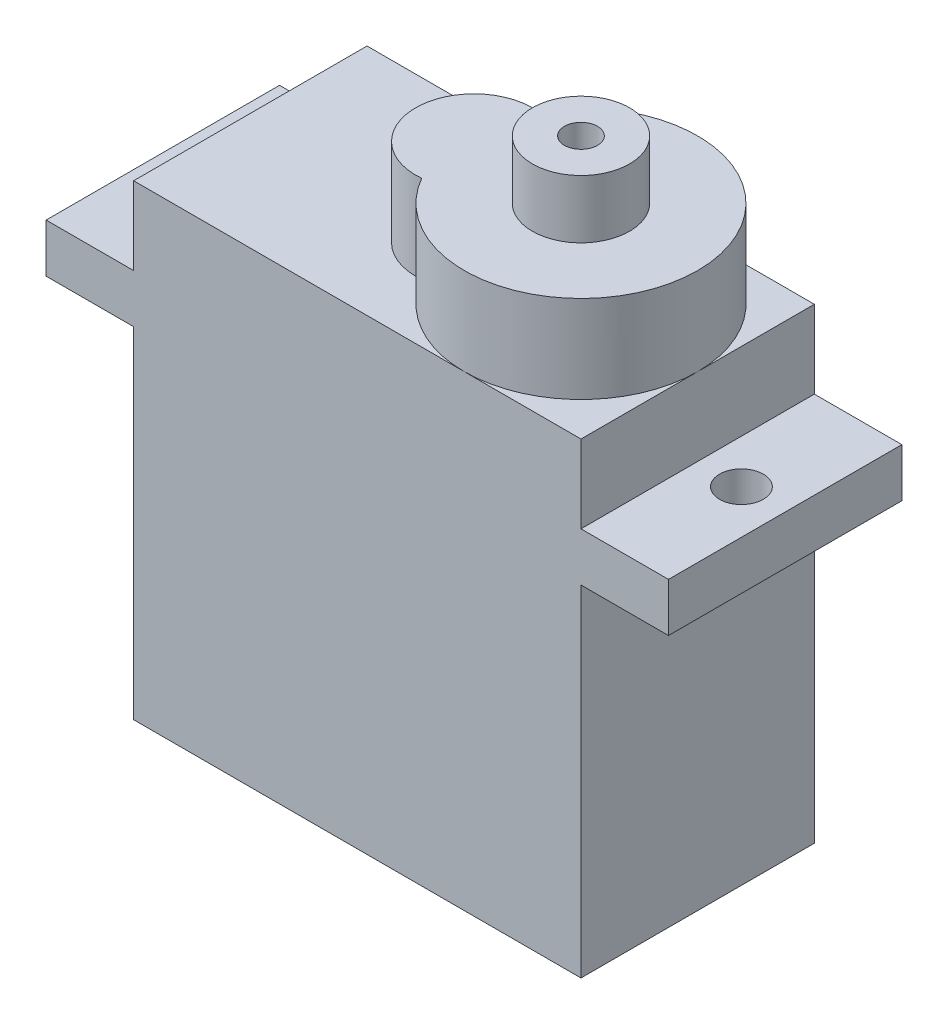
ISO-10303-21;
HEADER;
FILE_DESCRIPTION(('STEP AP214'),'2;1');
FILE_NAME('part.step','',(''),(''),'','','');
FILE_SCHEMA(('AUTOMOTIVE_DESIGN { 1 0 10303 214 1 1 1 1 }'));
ENDSEC;
DATA;
#1=APPLICATION_CONTEXT('core data for automotive mechanical design processes');
#2=APPLICATION_PROTOCOL_DEFINITION('international standard','automotive_design',2000,#1);
#3=PRODUCT_CONTEXT('',#1,'mechanical');
#4=PRODUCT('Part','Part','',(#3));
#5=PRODUCT_RELATED_PRODUCT_CATEGORY('part','',(#4));
#6=PRODUCT_DEFINITION_FORMATION('','',#4);
#7=PRODUCT_DEFINITION_CONTEXT('part definition',#1,'design');
#8=PRODUCT_DEFINITION('design','',#6,#7);
#9=PRODUCT_DEFINITION_SHAPE('','',#8);
#10=(LENGTH_UNIT() NAMED_UNIT(*) SI_UNIT(.MILLI.,.METRE.));
#11=(NAMED_UNIT(*) PLANE_ANGLE_UNIT() SI_UNIT($,.RADIAN.));
#12=(NAMED_UNIT(*) SI_UNIT($,.STERADIAN.) SOLID_ANGLE_UNIT());
#13=UNCERTAINTY_MEASURE_WITH_UNIT(LENGTH_MEASURE(1.E-05),#10,'distance_accuracy_value','');
#14=(GEOMETRIC_REPRESENTATION_CONTEXT(3) GLOBAL_UNCERTAINTY_ASSIGNED_CONTEXT((#13)) GLOBAL_UNIT_ASSIGNED_CONTEXT((#10,
#11,#12)) REPRESENTATION_CONTEXT('',''));
#15=CARTESIAN_POINT('',(0.,0.,0.));
#16=DIRECTION('',(0.,0.,1.));
#17=DIRECTION('',(1.,0.,0.));
#18=AXIS2_PLACEMENT_3D('',#15,#16,#17);
#19=CARTESIAN_POINT('',(-11.5,24.,6.));
#20=DIRECTION('',(1.,0.,0.));
#21=DIRECTION('',(0.,0.,-1.));
#22=AXIS2_PLACEMENT_3D('',#19,#20,#21);
#23=PLANE('',#22);
#24=DIRECTION('',(0.,0.,-1.));
#25=VECTOR('',#24,1.);
#26=CARTESIAN_POINT('',(-11.5,20.,-6.));
#27=LINE('',#26,#25);
#28=CARTESIAN_POINT('',(-11.5,20.,6.));
#29=VERTEX_POINT('',#28);
#30=CARTESIAN_POINT('',(-11.5,20.,-6.));
#31=VERTEX_POINT('',#30);
#32=EDGE_CURVE('E189',#29,#31,#27,.T.);
#33=ORIENTED_EDGE('',*,*,#32,.F.);
#34=DIRECTION('',(0.,-1.,0.));
#35=VECTOR('',#34,1.);
#36=CARTESIAN_POINT('',(-11.5,24.,6.));
#37=LINE('',#36,#35);
#38=CARTESIAN_POINT('',(-11.5,24.,6.));
#39=VERTEX_POINT('',#38);
#40=EDGE_CURVE('E47',#39,#29,#37,.T.);
#41=ORIENTED_EDGE('',*,*,#40,.F.);
#42=DIRECTION('',(0.,0.,1.));
#43=VECTOR('',#42,1.);
#44=CARTESIAN_POINT('',(-11.5,24.,6.));
#45=LINE('',#44,#43);
#46=CARTESIAN_POINT('',(-11.5,24.,-6.));
#47=VERTEX_POINT('',#46);
#48=EDGE_CURVE('E283',#47,#39,#45,.T.);
#49=ORIENTED_EDGE('',*,*,#48,.F.);
#50=DIRECTION('',(0.,-1.,0.));
#51=VECTOR('',#50,1.);
#52=CARTESIAN_POINT('',(-11.5,24.,-6.));
#53=LINE('',#52,#51);
#54=EDGE_CURVE('E320',#47,#31,#53,.T.);
#55=ORIENTED_EDGE('',*,*,#54,.T.);
#56=EDGE_LOOP('',(#33,#41,#49,#55));
#57=FACE_BOUND('',#56,.T.);
#58=ADVANCED_FACE('F44',(#57),#23,.F.);
#59=CARTESIAN_POINT('',(11.5,24.,6.));
#60=DIRECTION('',(-1.,0.,0.));
#61=DIRECTION('',(0.,0.,1.));
#62=AXIS2_PLACEMENT_3D('',#59,#60,#61);
#63=PLANE('',#62);
#64=DIRECTION('',(0.,0.,1.));
#65=VECTOR('',#64,1.);
#66=CARTESIAN_POINT('',(11.5,20.,-6.));
#67=LINE('',#66,#65);
#68=CARTESIAN_POINT('',(11.5,20.,-6.));
#69=VERTEX_POINT('',#68);
#70=CARTESIAN_POINT('',(11.5,20.,6.));
#71=VERTEX_POINT('',#70);
#72=EDGE_CURVE('E222',#69,#71,#67,.T.);
#73=ORIENTED_EDGE('',*,*,#72,.F.);
#74=DIRECTION('',(0.,-1.,0.));
#75=VECTOR('',#74,1.);
#76=CARTESIAN_POINT('',(11.5,24.,-6.));
#77=LINE('',#76,#75);
#78=CARTESIAN_POINT('',(11.5,24.,-6.));
#79=VERTEX_POINT('',#78);
#80=EDGE_CURVE('E325',#79,#69,#77,.T.);
#81=ORIENTED_EDGE('',*,*,#80,.F.);
#82=DIRECTION('',(0.,0.,-1.));
#83=VECTOR('',#82,1.);
#84=CARTESIAN_POINT('',(11.5,24.,6.));
#85=LINE('',#84,#83);
#86=CARTESIAN_POINT('',(11.5,24.,0.));
#87=VERTEX_POINT('',#86);
#88=EDGE_CURVE('E294',#87,#79,#85,.T.);
#89=ORIENTED_EDGE('',*,*,#88,.F.);
#90=CARTESIAN_POINT('',(11.5,24.,6.));
#91=VERTEX_POINT('',#90);
#92=EDGE_CURVE('E293',#91,#87,#85,.T.);
#93=ORIENTED_EDGE('',*,*,#92,.F.);
#94=DIRECTION('',(0.,-1.,0.));
#95=VECTOR('',#94,1.);
#96=CARTESIAN_POINT('',(11.5,24.,6.));
#97=LINE('',#96,#95);
#98=EDGE_CURVE('E326',#91,#71,#97,.T.);
#99=ORIENTED_EDGE('',*,*,#98,.T.);
#100=EDGE_LOOP('',(#73,#81,#89,#93,#99));
#101=FACE_BOUND('',#100,.T.);
#102=ADVANCED_FACE('F358',(#101),#63,.F.);
#103=CARTESIAN_POINT('',(0.,24.,0.));
#104=DIRECTION('',(0.,1.,0.));
#105=DIRECTION('',(0.,0.,1.));
#106=AXIS2_PLACEMENT_3D('',#103,#104,#105);
#107=PLANE('',#106);
#108=CARTESIAN_POINT('',(5.5,24.,0.));
#109=DIRECTION('',(0.,1.,0.));
#110=DIRECTION('',(0.,0.,1.));
#111=AXIS2_PLACEMENT_3D('',#108,#109,#110);
#112=CIRCLE('',#111,6.);
#113=CARTESIAN_POINT('',(0.295454545454537,24.,2.98541565139099));
#114=VERTEX_POINT('',#113);
#115=CARTESIAN_POINT('',(5.5,24.,6.));
#116=VERTEX_POINT('',#115);
#117=EDGE_CURVE('E256',#114,#116,#112,.T.);
#118=ORIENTED_EDGE('',*,*,#117,.F.);
#119=CARTESIAN_POINT('',(0.,24.,0.));
#120=DIRECTION('',(0.,1.,0.));
#121=DIRECTION('',(0.,0.,1.));
#122=AXIS2_PLACEMENT_3D('',#119,#120,#121);
#123=CIRCLE('',#122,3.);
#124=CARTESIAN_POINT('',(0.295454545454538,24.,-2.98541565139099));
#125=VERTEX_POINT('',#124);
#126=EDGE_CURVE('E264',#125,#114,#123,.T.);
#127=ORIENTED_EDGE('',*,*,#126,.F.);
#128=CARTESIAN_POINT('',(5.5,24.,-6.));
#129=VERTEX_POINT('',#128);
#130=EDGE_CURVE('E275',#129,#125,#112,.T.);
#131=ORIENTED_EDGE('',*,*,#130,.F.);
#132=DIRECTION('',(-1.,0.,0.));
#133=VECTOR('',#132,1.);
#134=CARTESIAN_POINT('',(11.5,24.,-6.));
#135=LINE('',#134,#133);
#136=EDGE_CURVE('E298',#129,#47,#135,.T.);
#137=ORIENTED_EDGE('',*,*,#136,.T.);
#138=ORIENTED_EDGE('',*,*,#48,.T.);
#139=DIRECTION('',(1.,0.,0.));
#140=VECTOR('',#139,1.);
#141=CARTESIAN_POINT('',(11.5,24.,6.));
#142=LINE('',#141,#140);
#143=EDGE_CURVE('E288',#39,#116,#142,.T.);
#144=ORIENTED_EDGE('',*,*,#143,.T.);
#145=EDGE_LOOP('',(#118,#127,#131,#137,#138,#144));
#146=FACE_BOUND('',#145,.T.);
#147=ADVANCED_FACE('F384',(#146),#107,.T.);
#148=EDGE_CURVE('E54',#116,#87,#112,.T.);
#149=ORIENTED_EDGE('',*,*,#148,.F.);
#150=EDGE_CURVE('E289',#116,#91,#142,.T.);
#151=ORIENTED_EDGE('',*,*,#150,.T.);
#152=ORIENTED_EDGE('',*,*,#92,.T.);
#153=EDGE_LOOP('',(#149,#151,#152));
#154=FACE_BOUND('',#153,.T.);
#155=ADVANCED_FACE('F360',(#154),#107,.T.);
#156=CARTESIAN_POINT('',(-11.5,17.5,6.));
#157=VERTEX_POINT('',#156);
#158=CARTESIAN_POINT('',(-11.5,0.,6.));
#159=VERTEX_POINT('',#158);
#160=EDGE_CURVE('E328',#157,#159,#37,.T.);
#161=ORIENTED_EDGE('',*,*,#160,.F.);
#162=DIRECTION('',(0.,0.,-1.));
#163=VECTOR('',#162,1.);
#164=CARTESIAN_POINT('',(-11.5,17.5,-6.));
#165=LINE('',#164,#163);
#166=CARTESIAN_POINT('',(-11.5,17.5,-6.));
#167=VERTEX_POINT('',#166);
#168=EDGE_CURVE('E182',#157,#167,#165,.T.);
#169=ORIENTED_EDGE('',*,*,#168,.T.);
#170=CARTESIAN_POINT('',(-11.5,0.,-6.));
#171=VERTEX_POINT('',#170);
#172=EDGE_CURVE('E176',#167,#171,#53,.T.);
#173=ORIENTED_EDGE('',*,*,#172,.T.);
#174=DIRECTION('',(0.,0.,1.));
#175=VECTOR('',#174,1.);
#176=CARTESIAN_POINT('',(-11.5,0.,6.));
#177=LINE('',#176,#175);
#178=EDGE_CURVE('E282',#171,#159,#177,.T.);
#179=ORIENTED_EDGE('',*,*,#178,.T.);
#180=EDGE_LOOP('',(#161,#169,#173,#179));
#181=FACE_BOUND('',#180,.T.);
#182=ADVANCED_FACE('F50',(#181),#23,.F.);
#183=CARTESIAN_POINT('',(11.5,24.,6.));
#184=DIRECTION('',(0.,0.,-1.));
#185=DIRECTION('',(-1.,0.,0.));
#186=AXIS2_PLACEMENT_3D('',#183,#184,#185);
#187=PLANE('',#186);
#188=DIRECTION('',(1.,0.,0.));
#189=VECTOR('',#188,1.);
#190=CARTESIAN_POINT('',(11.5,0.,6.));
#191=LINE('',#190,#189);
#192=CARTESIAN_POINT('',(11.5,0.,6.));
#193=VERTEX_POINT('',#192);
#194=EDGE_CURVE('E307',#159,#193,#191,.T.);
#195=ORIENTED_EDGE('',*,*,#194,.T.);
#196=CARTESIAN_POINT('',(11.5,17.5,6.));
#197=VERTEX_POINT('',#196);
#198=EDGE_CURVE('E324',#197,#193,#97,.T.);
#199=ORIENTED_EDGE('',*,*,#198,.F.);
#200=DIRECTION('',(1.,0.,0.));
#201=VECTOR('',#200,1.);
#202=CARTESIAN_POINT('',(11.5,17.5,6.));
#203=LINE('',#202,#201);
#204=CARTESIAN_POINT('',(16.,17.5,6.));
#205=VERTEX_POINT('',#204);
#206=EDGE_CURVE('E62',#197,#205,#203,.T.);
#207=ORIENTED_EDGE('',*,*,#206,.T.);
#208=DIRECTION('',(0.,1.,0.));
#209=VECTOR('',#208,1.);
#210=CARTESIAN_POINT('',(16.,17.5,6.));
#211=LINE('',#210,#209);
#212=CARTESIAN_POINT('',(16.,20.,6.));
#213=VERTEX_POINT('',#212);
#214=EDGE_CURVE('E202',#205,#213,#211,.T.);
#215=ORIENTED_EDGE('',*,*,#214,.T.);
#216=DIRECTION('',(1.,0.,0.));
#217=VECTOR('',#216,1.);
#218=CARTESIAN_POINT('',(11.5,20.,6.));
#219=LINE('',#218,#217);
#220=EDGE_CURVE('E216',#71,#213,#219,.T.);
#221=ORIENTED_EDGE('',*,*,#220,.F.);
#222=ORIENTED_EDGE('',*,*,#98,.F.);
#223=ORIENTED_EDGE('',*,*,#150,.F.);
#224=ORIENTED_EDGE('',*,*,#143,.F.);
#225=ORIENTED_EDGE('',*,*,#40,.T.);
#226=DIRECTION('',(1.,0.,0.));
#227=VECTOR('',#226,1.);
#228=CARTESIAN_POINT('',(-11.5,20.,6.));
#229=LINE('',#228,#227);
#230=CARTESIAN_POINT('',(-16.,20.,6.));
#231=VERTEX_POINT('',#230);
#232=EDGE_CURVE('E184',#231,#29,#229,.T.);
#233=ORIENTED_EDGE('',*,*,#232,.F.);
#234=DIRECTION('',(0.,1.,0.));
#235=VECTOR('',#234,1.);
#236=CARTESIAN_POINT('',(-16.,17.5,6.));
#237=LINE('',#236,#235);
#238=CARTESIAN_POINT('',(-16.,17.5,6.));
#239=VERTEX_POINT('',#238);
#240=EDGE_CURVE('E166',#239,#231,#237,.T.);
#241=ORIENTED_EDGE('',*,*,#240,.F.);
#242=DIRECTION('',(1.,0.,0.));
#243=VECTOR('',#242,1.);
#244=CARTESIAN_POINT('',(-11.5,17.5,6.));
#245=LINE('',#244,#243);
#246=EDGE_CURVE('E168',#239,#157,#245,.T.);
#247=ORIENTED_EDGE('',*,*,#246,.T.);
#248=ORIENTED_EDGE('',*,*,#160,.T.);
#249=EDGE_LOOP('',(#195,#199,#207,#215,#221,#222,#223,#224,#225,#233,#241,#247,#248));
#250=FACE_BOUND('',#249,.T.);
#251=ADVANCED_FACE('F341',(#250),#187,.F.);
#252=CARTESIAN_POINT('',(11.5,17.5,-6.));
#253=VERTEX_POINT('',#252);
#254=CARTESIAN_POINT('',(11.5,0.,-6.));
#255=VERTEX_POINT('',#254);
#256=EDGE_CURVE('E321',#253,#255,#77,.T.);
#257=ORIENTED_EDGE('',*,*,#256,.F.);
#258=DIRECTION('',(0.,0.,1.));
#259=VECTOR('',#258,1.);
#260=CARTESIAN_POINT('',(11.5,17.5,-6.));
#261=LINE('',#260,#259);
#262=EDGE_CURVE('E231',#253,#197,#261,.T.);
#263=ORIENTED_EDGE('',*,*,#262,.T.);
#264=ORIENTED_EDGE('',*,*,#198,.T.);
#265=DIRECTION('',(0.,0.,-1.));
#266=VECTOR('',#265,1.);
#267=CARTESIAN_POINT('',(11.5,0.,6.));
#268=LINE('',#267,#266);
#269=EDGE_CURVE('E313',#193,#255,#268,.T.);
#270=ORIENTED_EDGE('',*,*,#269,.T.);
#271=EDGE_LOOP('',(#257,#263,#264,#270));
#272=FACE_BOUND('',#271,.T.);
#273=ADVANCED_FACE('F338',(#272),#63,.F.);
#274=CARTESIAN_POINT('',(11.5,24.,-6.));
#275=DIRECTION('',(0.,0.,1.));
#276=DIRECTION('',(1.,0.,0.));
#277=AXIS2_PLACEMENT_3D('',#274,#275,#276);
#278=PLANE('',#277);
#279=DIRECTION('',(-1.,0.,0.));
#280=VECTOR('',#279,1.);
#281=CARTESIAN_POINT('',(11.5,0.,-6.));
#282=LINE('',#281,#280);
#283=EDGE_CURVE('E286',#255,#171,#282,.T.);
#284=ORIENTED_EDGE('',*,*,#283,.T.);
#285=ORIENTED_EDGE('',*,*,#172,.F.);
#286=DIRECTION('',(-1.,0.,0.));
#287=VECTOR('',#286,1.);
#288=CARTESIAN_POINT('',(-11.5,17.5,-6.));
#289=LINE('',#288,#287);
#290=CARTESIAN_POINT('',(-16.,17.5,-6.));
#291=VERTEX_POINT('',#290);
#292=EDGE_CURVE('E72',#167,#291,#289,.T.);
#293=ORIENTED_EDGE('',*,*,#292,.T.);
#294=DIRECTION('',(0.,1.,0.));
#295=VECTOR('',#294,1.);
#296=CARTESIAN_POINT('',(-16.,17.5,-6.));
#297=LINE('',#296,#295);
#298=CARTESIAN_POINT('',(-16.,20.,-6.));
#299=VERTEX_POINT('',#298);
#300=EDGE_CURVE('E159',#291,#299,#297,.T.);
#301=ORIENTED_EDGE('',*,*,#300,.T.);
#302=DIRECTION('',(-1.,0.,0.));
#303=VECTOR('',#302,1.);
#304=CARTESIAN_POINT('',(-11.5,20.,-6.));
#305=LINE('',#304,#303);
#306=EDGE_CURVE('E191',#31,#299,#305,.T.);
#307=ORIENTED_EDGE('',*,*,#306,.F.);
#308=ORIENTED_EDGE('',*,*,#54,.F.);
#309=ORIENTED_EDGE('',*,*,#136,.F.);
#310=EDGE_CURVE('E299',#79,#129,#135,.T.);
#311=ORIENTED_EDGE('',*,*,#310,.F.);
#312=ORIENTED_EDGE('',*,*,#80,.T.);
#313=DIRECTION('',(-1.,0.,0.));
#314=VECTOR('',#313,1.);
#315=CARTESIAN_POINT('',(11.5,20.,-6.));
#316=LINE('',#315,#314);
#317=CARTESIAN_POINT('',(16.,20.,-6.));
#318=VERTEX_POINT('',#317);
#319=EDGE_CURVE('E223',#318,#69,#316,.T.);
#320=ORIENTED_EDGE('',*,*,#319,.F.);
#321=DIRECTION('',(0.,1.,0.));
#322=VECTOR('',#321,1.);
#323=CARTESIAN_POINT('',(16.,17.5,-6.));
#324=LINE('',#323,#322);
#325=CARTESIAN_POINT('',(16.,17.5,-6.));
#326=VERTEX_POINT('',#325);
#327=EDGE_CURVE('E207',#326,#318,#324,.T.);
#328=ORIENTED_EDGE('',*,*,#327,.F.);
#329=DIRECTION('',(-1.,0.,0.));
#330=VECTOR('',#329,1.);
#331=CARTESIAN_POINT('',(11.5,17.5,-6.));
#332=LINE('',#331,#330);
#333=EDGE_CURVE('E220',#326,#253,#332,.T.);
#334=ORIENTED_EDGE('',*,*,#333,.T.);
#335=ORIENTED_EDGE('',*,*,#256,.T.);
#336=EDGE_LOOP('',(#284,#285,#293,#301,#307,#308,#309,#311,#312,#320,#328,#334,#335));
#337=FACE_BOUND('',#336,.T.);
#338=ADVANCED_FACE('F179',(#337),#278,.F.);
#339=EDGE_CURVE('E368',#87,#129,#112,.T.);
#340=ORIENTED_EDGE('',*,*,#339,.F.);
#341=ORIENTED_EDGE('',*,*,#88,.T.);
#342=ORIENTED_EDGE('',*,*,#310,.T.);
#343=EDGE_LOOP('',(#340,#341,#342));
#344=FACE_BOUND('',#343,.T.);
#345=ADVANCED_FACE('F365',(#344),#107,.T.);
#346=CARTESIAN_POINT('',(0.,0.,0.));
#347=DIRECTION('',(0.,1.,0.));
#348=DIRECTION('',(0.,0.,1.));
#349=AXIS2_PLACEMENT_3D('',#346,#347,#348);
#350=PLANE('',#349);
#351=ORIENTED_EDGE('',*,*,#178,.F.);
#352=ORIENTED_EDGE('',*,*,#283,.F.);
#353=ORIENTED_EDGE('',*,*,#269,.F.);
#354=ORIENTED_EDGE('',*,*,#194,.F.);
#355=EDGE_LOOP('',(#351,#352,#353,#354));
#356=FACE_BOUND('',#355,.T.);
#357=ADVANCED_FACE('F346',(#356),#350,.F.);
#358=CARTESIAN_POINT('',(5.5,28.5,0.));
#359=DIRECTION('',(0.,-1.,0.));
#360=DIRECTION('',(0.,0.,-1.));
#361=AXIS2_PLACEMENT_3D('',#358,#359,#360);
#362=CYLINDRICAL_SURFACE('',#361,6.);
#363=ORIENTED_EDGE('',*,*,#117,.T.);
#364=ORIENTED_EDGE('',*,*,#148,.T.);
#365=ORIENTED_EDGE('',*,*,#339,.T.);
#366=ORIENTED_EDGE('',*,*,#130,.T.);
#367=DIRECTION('',(0.,-1.,0.));
#368=VECTOR('',#367,1.);
#369=CARTESIAN_POINT('',(0.295454545454538,28.5,-2.98541565139099));
#370=LINE('',#369,#368);
#371=CARTESIAN_POINT('',(0.295454545454538,28.5,-2.98541565139099));
#372=VERTEX_POINT('',#371);
#373=EDGE_CURVE('E276',#372,#125,#370,.T.);
#374=ORIENTED_EDGE('',*,*,#373,.F.);
#375=CARTESIAN_POINT('',(5.5,28.5,0.));
#376=DIRECTION('',(0.,1.,0.));
#377=DIRECTION('',(0.,0.,1.));
#378=AXIS2_PLACEMENT_3D('',#375,#376,#377);
#379=CIRCLE('',#378,6.);
#380=CARTESIAN_POINT('',(0.295454545454537,28.5,2.98541565139099));
#381=VERTEX_POINT('',#380);
#382=EDGE_CURVE('E257',#381,#372,#379,.T.);
#383=ORIENTED_EDGE('',*,*,#382,.F.);
#384=DIRECTION('',(0.,-1.,0.));
#385=VECTOR('',#384,1.);
#386=CARTESIAN_POINT('',(0.295454545454537,28.5,2.98541565139099));
#387=LINE('',#386,#385);
#388=EDGE_CURVE('E268',#381,#114,#387,.T.);
#389=ORIENTED_EDGE('',*,*,#388,.T.);
#390=EDGE_LOOP('',(#363,#364,#365,#366,#374,#383,#389));
#391=FACE_BOUND('',#390,.T.);
#392=ADVANCED_FACE('F388',(#391),#362,.T.);
#393=CARTESIAN_POINT('',(0.,28.5,0.));
#394=DIRECTION('',(0.,-1.,0.));
#395=DIRECTION('',(0.,0.,-1.));
#396=AXIS2_PLACEMENT_3D('',#393,#394,#395);
#397=CYLINDRICAL_SURFACE('',#396,3.);
#398=ORIENTED_EDGE('',*,*,#126,.T.);
#399=ORIENTED_EDGE('',*,*,#388,.F.);
#400=CARTESIAN_POINT('',(0.,28.5,0.));
#401=DIRECTION('',(0.,1.,0.));
#402=DIRECTION('',(0.,0.,1.));
#403=AXIS2_PLACEMENT_3D('',#400,#401,#402);
#404=CIRCLE('',#403,3.);
#405=EDGE_CURVE('E262',#372,#381,#404,.T.);
#406=ORIENTED_EDGE('',*,*,#405,.F.);
#407=ORIENTED_EDGE('',*,*,#373,.T.);
#408=EDGE_LOOP('',(#398,#399,#406,#407));
#409=FACE_BOUND('',#408,.T.);
#410=ADVANCED_FACE('F389',(#409),#397,.T.);
#411=CARTESIAN_POINT('',(2.75,28.5,0.));
#412=DIRECTION('',(0.,1.,0.));
#413=DIRECTION('',(0.,0.,1.));
#414=AXIS2_PLACEMENT_3D('',#411,#412,#413);
#415=PLANE('',#414);
#416=CARTESIAN_POINT('',(5.5,28.5,0.));
#417=DIRECTION('',(0.,1.,0.));
#418=DIRECTION('',(0.,0.,1.));
#419=AXIS2_PLACEMENT_3D('',#416,#417,#418);
#420=CIRCLE('',#419,2.5);
#421=CARTESIAN_POINT('',(5.5,28.5,2.5));
#422=VERTEX_POINT('',#421);
#423=EDGE_CURVE('E11',#422,#422,#420,.T.);
#424=ORIENTED_EDGE('',*,*,#423,.F.);
#425=EDGE_LOOP('',(#424));
#426=FACE_BOUND('',#425,.T.);
#427=ORIENTED_EDGE('',*,*,#382,.T.);
#428=ORIENTED_EDGE('',*,*,#405,.T.);
#429=EDGE_LOOP('',(#427,#428));
#430=FACE_BOUND('',#429,.T.);
#431=ADVANCED_FACE('F395',(#426,#430),#415,.T.);
#432=CARTESIAN_POINT('',(5.5,31.5,0.));
#433=DIRECTION('',(0.,-1.,0.));
#434=DIRECTION('',(0.,0.,-1.));
#435=AXIS2_PLACEMENT_3D('',#432,#433,#434);
#436=CYLINDRICAL_SURFACE('',#435,2.5);
#437=CARTESIAN_POINT('',(5.5,31.5,0.));
#438=DIRECTION('',(0.,1.,0.));
#439=DIRECTION('',(0.,0.,1.));
#440=AXIS2_PLACEMENT_3D('',#437,#438,#439);
#441=CIRCLE('',#440,2.5);
#442=CARTESIAN_POINT('',(5.5,31.5,2.5));
#443=VERTEX_POINT('',#442);
#444=EDGE_CURVE('E252',#443,#443,#441,.T.);
#445=ORIENTED_EDGE('',*,*,#444,.F.);
#446=EDGE_LOOP('',(#445));
#447=FACE_BOUND('',#446,.T.);
#448=ORIENTED_EDGE('',*,*,#423,.T.);
#449=EDGE_LOOP('',(#448));
#450=FACE_BOUND('',#449,.T.);
#451=ADVANCED_FACE('F393',(#447,#450),#436,.T.);
#452=CARTESIAN_POINT('',(5.5,31.5,0.));
#453=DIRECTION('',(0.,1.,0.));
#454=DIRECTION('',(0.,0.,1.));
#455=AXIS2_PLACEMENT_3D('',#452,#453,#454);
#456=PLANE('',#455);
#457=CARTESIAN_POINT('',(5.5,31.5,0.));
#458=DIRECTION('',(0.,1.,0.));
#459=DIRECTION('',(0.,0.,1.));
#460=AXIS2_PLACEMENT_3D('',#457,#458,#459);
#461=CIRCLE('',#460,0.85);
#462=CARTESIAN_POINT('',(5.5,31.5,0.85));
#463=VERTEX_POINT('',#462);
#464=EDGE_CURVE('E201',#463,#463,#461,.T.);
#465=ORIENTED_EDGE('',*,*,#464,.F.);
#466=EDGE_LOOP('',(#465));
#467=FACE_BOUND('',#466,.T.);
#468=ORIENTED_EDGE('',*,*,#444,.T.);
#469=EDGE_LOOP('',(#468));
#470=FACE_BOUND('',#469,.T.);
#471=ADVANCED_FACE('F402',(#467,#470),#456,.T.);
#472=CARTESIAN_POINT('',(5.5,26.5,0.));
#473=DIRECTION('',(0.,1.,0.));
#474=DIRECTION('',(0.,0.,1.));
#475=AXIS2_PLACEMENT_3D('',#472,#473,#474);
#476=CYLINDRICAL_SURFACE('',#475,0.85);
#477=CARTESIAN_POINT('',(5.5,26.5,0.));
#478=DIRECTION('',(0.,1.,0.));
#479=DIRECTION('',(0.,0.,1.));
#480=AXIS2_PLACEMENT_3D('',#477,#478,#479);
#481=CIRCLE('',#480,0.85);
#482=CARTESIAN_POINT('',(5.5,26.5,0.85));
#483=VERTEX_POINT('',#482);
#484=EDGE_CURVE('E249',#483,#483,#481,.T.);
#485=ORIENTED_EDGE('',*,*,#484,.F.);
#486=EDGE_LOOP('',(#485));
#487=FACE_BOUND('',#486,.T.);
#488=ORIENTED_EDGE('',*,*,#464,.T.);
#489=EDGE_LOOP('',(#488));
#490=FACE_BOUND('',#489,.T.);
#491=ADVANCED_FACE('F538',(#487,#490),#476,.F.);
#492=CARTESIAN_POINT('',(5.5,26.5,0.));
#493=DIRECTION('',(0.,1.,0.));
#494=DIRECTION('',(0.,0.,1.));
#495=AXIS2_PLACEMENT_3D('',#492,#493,#494);
#496=PLANE('',#495);
#497=ORIENTED_EDGE('',*,*,#484,.T.);
#498=EDGE_LOOP('',(#497));
#499=FACE_BOUND('',#498,.T.);
#500=ADVANCED_FACE('F463',(#499),#496,.T.);
#501=CARTESIAN_POINT('',(16.,17.5,-6.));
#502=DIRECTION('',(1.,0.,0.));
#503=DIRECTION('',(0.,0.,-1.));
#504=AXIS2_PLACEMENT_3D('',#501,#502,#503);
#505=PLANE('',#504);
#506=DIRECTION('',(0.,0.,-1.));
#507=VECTOR('',#506,1.);
#508=CARTESIAN_POINT('',(16.,20.,-6.));
#509=LINE('',#508,#507);
#510=EDGE_CURVE('E215',#213,#318,#509,.T.);
#511=ORIENTED_EDGE('',*,*,#510,.F.);
#512=ORIENTED_EDGE('',*,*,#214,.F.);
#513=DIRECTION('',(0.,0.,-1.));
#514=VECTOR('',#513,1.);
#515=CARTESIAN_POINT('',(16.,17.5,-6.));
#516=LINE('',#515,#514);
#517=EDGE_CURVE('E208',#205,#326,#516,.T.);
#518=ORIENTED_EDGE('',*,*,#517,.T.);
#519=ORIENTED_EDGE('',*,*,#327,.T.);
#520=EDGE_LOOP('',(#511,#512,#518,#519));
#521=FACE_BOUND('',#520,.T.);
#522=ADVANCED_FACE('F456',(#521),#505,.T.);
#523=CARTESIAN_POINT('',(0.,17.5,0.));
#524=DIRECTION('',(0.,-1.,0.));
#525=DIRECTION('',(0.,0.,-1.));
#526=AXIS2_PLACEMENT_3D('',#523,#524,#525);
#527=PLANE('',#526);
#528=CARTESIAN_POINT('',(13.75,17.5,0.));
#529=DIRECTION('',(0.,1.,0.));
#530=DIRECTION('',(0.,0.,-1.));
#531=AXIS2_PLACEMENT_3D('',#528,#529,#530);
#532=CIRCLE('',#531,1.125);
#533=CARTESIAN_POINT('',(13.75,17.5,-1.125));
#534=VERTEX_POINT('',#533);
#535=EDGE_CURVE('E227',#534,#534,#532,.T.);
#536=ORIENTED_EDGE('',*,*,#535,.T.);
#537=EDGE_LOOP('',(#536));
#538=FACE_BOUND('',#537,.T.);
#539=ORIENTED_EDGE('',*,*,#333,.F.);
#540=ORIENTED_EDGE('',*,*,#517,.F.);
#541=ORIENTED_EDGE('',*,*,#206,.F.);
#542=ORIENTED_EDGE('',*,*,#262,.F.);
#543=EDGE_LOOP('',(#539,#540,#541,#542));
#544=FACE_BOUND('',#543,.T.);
#545=ADVANCED_FACE('F462',(#538,#544),#527,.T.);
#546=CARTESIAN_POINT('',(0.,20.,0.));
#547=DIRECTION('',(0.,-1.,0.));
#548=DIRECTION('',(0.,0.,-1.));
#549=AXIS2_PLACEMENT_3D('',#546,#547,#548);
#550=PLANE('',#549);
#551=CARTESIAN_POINT('',(13.75,20.,0.));
#552=DIRECTION('',(0.,1.,0.));
#553=DIRECTION('',(0.,0.,-1.));
#554=AXIS2_PLACEMENT_3D('',#551,#552,#553);
#555=CIRCLE('',#554,1.125);
#556=CARTESIAN_POINT('',(13.75,20.,-1.125));
#557=VERTEX_POINT('',#556);
#558=EDGE_CURVE('E238',#557,#557,#555,.T.);
#559=ORIENTED_EDGE('',*,*,#558,.F.);
#560=EDGE_LOOP('',(#559));
#561=FACE_BOUND('',#560,.T.);
#562=ORIENTED_EDGE('',*,*,#319,.T.);
#563=ORIENTED_EDGE('',*,*,#72,.T.);
#564=ORIENTED_EDGE('',*,*,#220,.T.);
#565=ORIENTED_EDGE('',*,*,#510,.T.);
#566=EDGE_LOOP('',(#562,#563,#564,#565));
#567=FACE_BOUND('',#566,.T.);
#568=ADVANCED_FACE('F474',(#561,#567),#550,.F.);
#569=CARTESIAN_POINT('',(13.75,17.5,0.));
#570=DIRECTION('',(0.,1.,0.));
#571=DIRECTION('',(0.,0.,1.));
#572=AXIS2_PLACEMENT_3D('',#569,#570,#571);
#573=CYLINDRICAL_SURFACE('',#572,1.125);
#574=ORIENTED_EDGE('',*,*,#535,.F.);
#575=EDGE_LOOP('',(#574));
#576=FACE_BOUND('',#575,.T.);
#577=ORIENTED_EDGE('',*,*,#558,.T.);
#578=EDGE_LOOP('',(#577));
#579=FACE_BOUND('',#578,.T.);
#580=ADVANCED_FACE('F484',(#576,#579),#573,.F.);
#581=CARTESIAN_POINT('',(-16.,17.5,-6.));
#582=DIRECTION('',(-1.,0.,0.));
#583=DIRECTION('',(0.,0.,1.));
#584=AXIS2_PLACEMENT_3D('',#581,#582,#583);
#585=PLANE('',#584);
#586=DIRECTION('',(0.,0.,1.));
#587=VECTOR('',#586,1.);
#588=CARTESIAN_POINT('',(-16.,20.,-6.));
#589=LINE('',#588,#587);
#590=EDGE_CURVE('E164',#299,#231,#589,.T.);
#591=ORIENTED_EDGE('',*,*,#590,.F.);
#592=ORIENTED_EDGE('',*,*,#300,.F.);
#593=DIRECTION('',(0.,0.,1.));
#594=VECTOR('',#593,1.);
#595=CARTESIAN_POINT('',(-16.,17.5,-6.));
#596=LINE('',#595,#594);
#597=EDGE_CURVE('E165',#291,#239,#596,.T.);
#598=ORIENTED_EDGE('',*,*,#597,.T.);
#599=ORIENTED_EDGE('',*,*,#240,.T.);
#600=EDGE_LOOP('',(#591,#592,#598,#599));
#601=FACE_BOUND('',#600,.T.);
#602=ADVANCED_FACE('F161',(#601),#585,.T.);
#603=CARTESIAN_POINT('',(0.,17.5,0.));
#604=DIRECTION('',(0.,-1.,0.));
#605=DIRECTION('',(0.,0.,-1.));
#606=AXIS2_PLACEMENT_3D('',#603,#604,#605);
#607=PLANE('',#606);
#608=CARTESIAN_POINT('',(-13.75,17.5,0.));
#609=DIRECTION('',(0.,1.,0.));
#610=DIRECTION('',(0.,0.,1.));
#611=AXIS2_PLACEMENT_3D('',#608,#609,#610);
#612=CIRCLE('',#611,1.125);
#613=CARTESIAN_POINT('',(-13.75,17.5,1.125));
#614=VERTEX_POINT('',#613);
#615=EDGE_CURVE('E193',#614,#614,#612,.T.);
#616=ORIENTED_EDGE('',*,*,#615,.T.);
#617=EDGE_LOOP('',(#616));
#618=FACE_BOUND('',#617,.T.);
#619=ORIENTED_EDGE('',*,*,#168,.F.);
#620=ORIENTED_EDGE('',*,*,#246,.F.);
#621=ORIENTED_EDGE('',*,*,#597,.F.);
#622=ORIENTED_EDGE('',*,*,#292,.F.);
#623=EDGE_LOOP('',(#619,#620,#621,#622));
#624=FACE_BOUND('',#623,.T.);
#625=ADVANCED_FACE('F175',(#618,#624),#607,.T.);
#626=CARTESIAN_POINT('',(0.,20.,0.));
#627=DIRECTION('',(0.,-1.,0.));
#628=DIRECTION('',(0.,0.,-1.));
#629=AXIS2_PLACEMENT_3D('',#626,#627,#628);
#630=PLANE('',#629);
#631=CARTESIAN_POINT('',(-13.75,20.,0.));
#632=DIRECTION('',(0.,1.,0.));
#633=DIRECTION('',(0.,0.,1.));
#634=AXIS2_PLACEMENT_3D('',#631,#632,#633);
#635=CIRCLE('',#634,1.125);
#636=CARTESIAN_POINT('',(-13.75,20.,1.125));
#637=VERTEX_POINT('',#636);
#638=EDGE_CURVE('E243',#637,#637,#635,.T.);
#639=ORIENTED_EDGE('',*,*,#638,.F.);
#640=EDGE_LOOP('',(#639));
#641=FACE_BOUND('',#640,.T.);
#642=ORIENTED_EDGE('',*,*,#32,.T.);
#643=ORIENTED_EDGE('',*,*,#306,.T.);
#644=ORIENTED_EDGE('',*,*,#590,.T.);
#645=ORIENTED_EDGE('',*,*,#232,.T.);
#646=EDGE_LOOP('',(#642,#643,#644,#645));
#647=FACE_BOUND('',#646,.T.);
#648=ADVANCED_FACE('F385',(#641,#647),#630,.F.);
#649=CARTESIAN_POINT('',(-13.75,17.5,0.));
#650=DIRECTION('',(0.,1.,0.));
#651=DIRECTION('',(0.,0.,1.));
#652=AXIS2_PLACEMENT_3D('',#649,#650,#651);
#653=CYLINDRICAL_SURFACE('',#652,1.125);
#654=ORIENTED_EDGE('',*,*,#615,.F.);
#655=EDGE_LOOP('',(#654));
#656=FACE_BOUND('',#655,.T.);
#657=ORIENTED_EDGE('',*,*,#638,.T.);
#658=EDGE_LOOP('',(#657));
#659=FACE_BOUND('',#658,.T.);
#660=ADVANCED_FACE('F522',(#656,#659),#653,.F.);
#661=CLOSED_SHELL('',(#58,#102,#147,#155,#182,#251,#273,#338,#345,#357,#392,#410,#431,#451,#471,
#491,#500,#522,#545,#568,#580,#602,#625,#648,#660));
#662=MANIFOLD_SOLID_BREP('B2',#661);
#663=ADVANCED_BREP_SHAPE_REPRESENTATION('',(#18,#662),#14);
#664=SHAPE_DEFINITION_REPRESENTATION(#9,#663);
ENDSEC;
END-ISO-10303-21;
